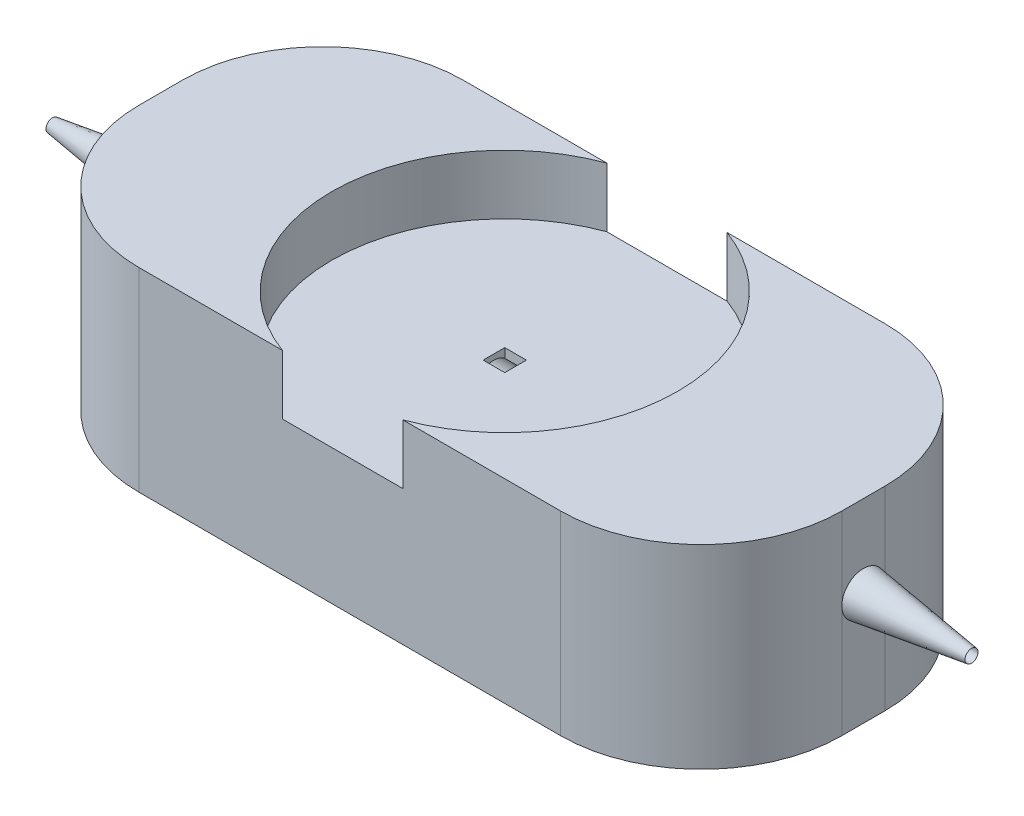
ISO-10303-21;
HEADER;
FILE_DESCRIPTION(('STEP AP214'),'2;1');
FILE_NAME('part.step','',(''),(''),'','','');
FILE_SCHEMA(('AUTOMOTIVE_DESIGN { 1 0 10303 214 1 1 1 1 }'));
ENDSEC;
DATA;
#1=APPLICATION_CONTEXT('core data for automotive mechanical design processes');
#2=APPLICATION_PROTOCOL_DEFINITION('international standard','automotive_design',2000,#1);
#3=PRODUCT_CONTEXT('',#1,'mechanical');
#4=PRODUCT('Part','Part','',(#3));
#5=PRODUCT_RELATED_PRODUCT_CATEGORY('part','',(#4));
#6=PRODUCT_DEFINITION_FORMATION('','',#4);
#7=PRODUCT_DEFINITION_CONTEXT('part definition',#1,'design');
#8=PRODUCT_DEFINITION('design','',#6,#7);
#9=PRODUCT_DEFINITION_SHAPE('','',#8);
#10=(LENGTH_UNIT() NAMED_UNIT(*) SI_UNIT(.MILLI.,.METRE.));
#11=(NAMED_UNIT(*) PLANE_ANGLE_UNIT() SI_UNIT($,.RADIAN.));
#12=(NAMED_UNIT(*) SI_UNIT($,.STERADIAN.) SOLID_ANGLE_UNIT());
#13=UNCERTAINTY_MEASURE_WITH_UNIT(LENGTH_MEASURE(1.E-05),#10,'distance_accuracy_value','');
#14=(GEOMETRIC_REPRESENTATION_CONTEXT(3) GLOBAL_UNCERTAINTY_ASSIGNED_CONTEXT((#13)) GLOBAL_UNIT_ASSIGNED_CONTEXT((#10,
#11,#12)) REPRESENTATION_CONTEXT('',''));
#15=CARTESIAN_POINT('',(0.,0.,0.));
#16=DIRECTION('',(0.,0.,1.));
#17=DIRECTION('',(1.,0.,0.));
#18=AXIS2_PLACEMENT_3D('',#15,#16,#17);
#19=CARTESIAN_POINT('',(40.001,50.4,0.));
#20=DIRECTION('',(-1.,0.,0.));
#21=DIRECTION('',(0.,0.,1.));
#22=AXIS2_PLACEMENT_3D('',#19,#20,#21);
#23=CYLINDRICAL_SURFACE('',#22,1.6);
#24=CARTESIAN_POINT('',(-25.,50.4,0.));
#25=DIRECTION('',(1.,0.,0.));
#26=DIRECTION('',(0.,0.,-1.));
#27=AXIS2_PLACEMENT_3D('',#24,#25,#26);
#28=CIRCLE('',#27,1.6);
#29=CARTESIAN_POINT('',(-25.,50.4,-1.6));
#30=VERTEX_POINT('',#29);
#31=EDGE_CURVE('E725',#30,#30,#28,.F.);
#32=ORIENTED_EDGE('',*,*,#31,.T.);
#33=EDGE_LOOP('',(#32));
#34=FACE_BOUND('',#33,.T.);
#35=DIRECTION('',(-1.,0.,0.));
#36=VECTOR('',#35,1.);
#37=CARTESIAN_POINT('',(40.001,51.6489995996798,0.999999999999832));
#38=LINE('',#37,#36);
#39=CARTESIAN_POINT('',(5.82850828649366,51.6489995996798,0.999999999999832));
#40=VERTEX_POINT('',#39);
#41=CARTESIAN_POINT('',(7.82850828649366,51.6489995996798,0.999999999999832));
#42=VERTEX_POINT('',#41);
#43=EDGE_CURVE('E256',#40,#42,#38,.F.);
#44=ORIENTED_EDGE('',*,*,#43,.T.);
#45=CARTESIAN_POINT('',(7.82850828649365,50.4,0.));
#46=DIRECTION('',(1.,0.,0.));
#47=DIRECTION('',(0.,0.,-1.));
#48=AXIS2_PLACEMENT_3D('',#45,#46,#47);
#49=CIRCLE('',#48,1.6);
#50=CARTESIAN_POINT('',(7.82850828649366,51.6489995996795,-1.00000000000017));
#51=VERTEX_POINT('',#50);
#52=EDGE_CURVE('E261',#42,#51,#49,.F.);
#53=ORIENTED_EDGE('',*,*,#52,.T.);
#54=DIRECTION('',(-1.,0.,0.));
#55=VECTOR('',#54,1.);
#56=CARTESIAN_POINT('',(40.001,51.6489995996795,-1.00000000000017));
#57=LINE('',#56,#55);
#58=CARTESIAN_POINT('',(5.82850828649366,51.6489995996795,-1.00000000000017));
#59=VERTEX_POINT('',#58);
#60=EDGE_CURVE('E248',#51,#59,#57,.T.);
#61=ORIENTED_EDGE('',*,*,#60,.T.);
#62=CARTESIAN_POINT('',(5.82850828649366,50.4,0.));
#63=DIRECTION('',(-1.,0.,0.));
#64=DIRECTION('',(0.,0.,1.));
#65=AXIS2_PLACEMENT_3D('',#62,#63,#64);
#66=CIRCLE('',#65,1.6);
#67=EDGE_CURVE('E252',#59,#40,#66,.F.);
#68=ORIENTED_EDGE('',*,*,#67,.T.);
#69=EDGE_LOOP('',(#44,#53,#61,#68));
#70=FACE_BOUND('',#69,.T.);
#71=DIRECTION('',(-1.,0.,0.));
#72=VECTOR('',#71,1.);
#73=CARTESIAN_POINT('',(40.001,49.1510004003205,-1.00000000000017));
#74=LINE('',#73,#72);
#75=CARTESIAN_POINT('',(5.82850828649366,49.1510004003205,-1.00000000000017));
#76=VERTEX_POINT('',#75);
#77=CARTESIAN_POINT('',(7.82850828649365,49.1510004003205,-1.00000000000017));
#78=VERTEX_POINT('',#77);
#79=EDGE_CURVE('E265',#76,#78,#74,.F.);
#80=ORIENTED_EDGE('',*,*,#79,.T.);
#81=CARTESIAN_POINT('',(7.82850828649366,49.1510004003202,0.999999999999832));
#82=VERTEX_POINT('',#81);
#83=EDGE_CURVE('E266',#78,#82,#49,.F.);
#84=ORIENTED_EDGE('',*,*,#83,.T.);
#85=DIRECTION('',(-1.,0.,0.));
#86=VECTOR('',#85,1.);
#87=CARTESIAN_POINT('',(40.001,49.1510004003202,0.999999999999832));
#88=LINE('',#87,#86);
#89=CARTESIAN_POINT('',(5.82850828649366,49.1510004003202,0.999999999999832));
#90=VERTEX_POINT('',#89);
#91=EDGE_CURVE('E270',#82,#90,#88,.T.);
#92=ORIENTED_EDGE('',*,*,#91,.T.);
#93=EDGE_CURVE('E257',#90,#76,#66,.F.);
#94=ORIENTED_EDGE('',*,*,#93,.T.);
#95=EDGE_LOOP('',(#80,#84,#92,#94));
#96=FACE_BOUND('',#95,.T.);
#97=CARTESIAN_POINT('',(39.9952357151676,50.4,0.));
#98=DIRECTION('',(1.,0.,0.));
#99=DIRECTION('',(0.,0.,-1.));
#100=AXIS2_PLACEMENT_3D('',#97,#98,#99);
#101=CIRCLE('',#100,1.6);
#102=CARTESIAN_POINT('',(39.9952357151676,50.4,-1.6));
#103=VERTEX_POINT('',#102);
#104=EDGE_CURVE('E56',#103,#103,#101,.F.);
#105=ORIENTED_EDGE('',*,*,#104,.F.);
#106=EDGE_LOOP('',(#105));
#107=FACE_BOUND('',#106,.T.);
#108=ADVANCED_FACE('F47',(#34,#70,#96,#107),#23,.F.);
#109=CARTESIAN_POINT('',(-25.,58.,15.));
#110=DIRECTION('',(1.,0.,0.));
#111=DIRECTION('',(0.,0.,-1.));
#112=AXIS2_PLACEMENT_3D('',#109,#110,#111);
#113=PLANE('',#112);
#114=DIRECTION('',(0.,-1.,0.));
#115=VECTOR('',#114,1.);
#116=CARTESIAN_POINT('',(-25.,58.,-1.99999999999999));
#117=LINE('',#116,#115);
#118=CARTESIAN_POINT('',(-25.,58.,-1.99999999999999));
#119=VERTEX_POINT('',#118);
#120=CARTESIAN_POINT('',(-25.,50.4,-1.99999999999999));
#121=VERTEX_POINT('',#120);
#122=EDGE_CURVE('E205',#119,#121,#117,.T.);
#123=ORIENTED_EDGE('',*,*,#122,.T.);
#124=CARTESIAN_POINT('',(-25.,50.4,0.));
#125=DIRECTION('',(1.,0.,0.));
#126=DIRECTION('',(0.,0.,-1.));
#127=AXIS2_PLACEMENT_3D('',#124,#125,#126);
#128=CIRCLE('',#127,2.);
#129=CARTESIAN_POINT('',(-25.,50.4,2.00000000000001));
#130=VERTEX_POINT('',#129);
#131=EDGE_CURVE('E62',#121,#130,#128,.T.);
#132=ORIENTED_EDGE('',*,*,#131,.T.);
#133=DIRECTION('',(0.,-1.,0.));
#134=VECTOR('',#133,1.);
#135=CARTESIAN_POINT('',(-25.,58.,2.00000000000001));
#136=LINE('',#135,#134);
#137=CARTESIAN_POINT('',(-25.,58.,2.00000000000001));
#138=VERTEX_POINT('',#137);
#139=EDGE_CURVE('E202',#130,#138,#136,.F.);
#140=ORIENTED_EDGE('',*,*,#139,.T.);
#141=DIRECTION('',(0.,0.,1.));
#142=VECTOR('',#141,1.);
#143=CARTESIAN_POINT('',(-25.,58.,15.));
#144=LINE('',#143,#142);
#145=EDGE_CURVE('E375',#119,#138,#144,.T.);
#146=ORIENTED_EDGE('',*,*,#145,.F.);
#147=EDGE_LOOP('',(#123,#132,#140,#146));
#148=FACE_BOUND('',#147,.T.);
#149=ADVANCED_FACE('F200',(#148),#113,.F.);
#150=CARTESIAN_POINT('',(0.,58.,0.));
#151=DIRECTION('',(0.,-1.,0.));
#152=DIRECTION('',(0.,0.,-1.));
#153=AXIS2_PLACEMENT_3D('',#150,#151,#152);
#154=PLANE('',#153);
#155=DIRECTION('',(-1.,0.,0.));
#156=VECTOR('',#155,1.);
#157=CARTESIAN_POINT('',(-25.,58.,-15.));
#158=LINE('',#157,#156);
#159=CARTESIAN_POINT('',(27.,58.,-15.));
#160=VERTEX_POINT('',#159);
#161=CARTESIAN_POINT('',(12.3962726493241,58.,-15.));
#162=VERTEX_POINT('',#161);
#163=EDGE_CURVE('E371',#160,#162,#158,.T.);
#164=ORIENTED_EDGE('',*,*,#163,.T.);
#165=CARTESIAN_POINT('',(6.82850828649366,58.,-1.6826817716975E-13));
#166=DIRECTION('',(0.,1.,0.));
#167=DIRECTION('',(0.,0.,1.));
#168=AXIS2_PLACEMENT_3D('',#165,#166,#167);
#169=CIRCLE('',#168,16.);
#170=CARTESIAN_POINT('',(12.3962726493232,58.,15.));
#171=VERTEX_POINT('',#170);
#172=EDGE_CURVE('E296',#171,#162,#169,.T.);
#173=ORIENTED_EDGE('',*,*,#172,.F.);
#174=DIRECTION('',(1.,0.,0.));
#175=VECTOR('',#174,1.);
#176=CARTESIAN_POINT('',(-25.,58.,15.));
#177=LINE('',#176,#175);
#178=CARTESIAN_POINT('',(27.,58.,15.));
#179=VERTEX_POINT('',#178);
#180=EDGE_CURVE('E378',#171,#179,#177,.T.);
#181=ORIENTED_EDGE('',*,*,#180,.T.);
#182=CARTESIAN_POINT('',(27.,58.,2.00000000000001));
#183=DIRECTION('',(0.,-1.,0.));
#184=DIRECTION('',(0.,0.,-1.));
#185=AXIS2_PLACEMENT_3D('',#182,#183,#184);
#186=CIRCLE('',#185,13.);
#187=CARTESIAN_POINT('',(40.,58.,2.00000000000001));
#188=VERTEX_POINT('',#187);
#189=EDGE_CURVE('E400',#179,#188,#186,.F.);
#190=ORIENTED_EDGE('',*,*,#189,.T.);
#191=DIRECTION('',(0.,0.,-1.));
#192=VECTOR('',#191,1.);
#193=CARTESIAN_POINT('',(40.,58.,15.));
#194=LINE('',#193,#192);
#195=CARTESIAN_POINT('',(40.,58.,-2.));
#196=VERTEX_POINT('',#195);
#197=EDGE_CURVE('E366',#188,#196,#194,.T.);
#198=ORIENTED_EDGE('',*,*,#197,.T.);
#199=CARTESIAN_POINT('',(27.,58.,-2.));
#200=DIRECTION('',(0.,-1.,0.));
#201=DIRECTION('',(0.,0.,-1.));
#202=AXIS2_PLACEMENT_3D('',#199,#200,#201);
#203=CIRCLE('',#202,13.);
#204=EDGE_CURVE('E216',#196,#160,#203,.F.);
#205=ORIENTED_EDGE('',*,*,#204,.T.);
#206=EDGE_LOOP('',(#164,#173,#181,#190,#198,#205));
#207=FACE_BOUND('',#206,.T.);
#208=ADVANCED_FACE('F410',(#207),#154,.F.);
#209=CARTESIAN_POINT('',(40.,58.,15.));
#210=DIRECTION('',(-1.,0.,0.));
#211=DIRECTION('',(0.,0.,1.));
#212=AXIS2_PLACEMENT_3D('',#209,#210,#211);
#213=PLANE('',#212);
#214=CARTESIAN_POINT('',(40.,50.4,0.));
#215=DIRECTION('',(-1.,0.,0.));
#216=DIRECTION('',(0.,0.,1.));
#217=AXIS2_PLACEMENT_3D('',#214,#215,#216);
#218=CIRCLE('',#217,1.99933300012347);
#219=CARTESIAN_POINT('',(40.,50.4,1.99933300012347));
#220=VERTEX_POINT('',#219);
#221=EDGE_CURVE('E11',#220,#220,#218,.F.);
#222=ORIENTED_EDGE('',*,*,#221,.F.);
#223=EDGE_LOOP('',(#222));
#224=FACE_BOUND('',#223,.T.);
#225=DIRECTION('',(0.,0.,1.));
#226=VECTOR('',#225,1.);
#227=CARTESIAN_POINT('',(40.,40.,15.));
#228=LINE('',#227,#226);
#229=CARTESIAN_POINT('',(40.,40.,-2.));
#230=VERTEX_POINT('',#229);
#231=CARTESIAN_POINT('',(40.,40.,2.00000000000001));
#232=VERTEX_POINT('',#231);
#233=EDGE_CURVE('E359',#230,#232,#228,.T.);
#234=ORIENTED_EDGE('',*,*,#233,.F.);
#235=DIRECTION('',(0.,-1.,0.));
#236=VECTOR('',#235,1.);
#237=CARTESIAN_POINT('',(40.,58.,-2.));
#238=LINE('',#237,#236);
#239=EDGE_CURVE('E395',#230,#196,#238,.F.);
#240=ORIENTED_EDGE('',*,*,#239,.T.);
#241=ORIENTED_EDGE('',*,*,#197,.F.);
#242=DIRECTION('',(0.,-1.,0.));
#243=VECTOR('',#242,1.);
#244=CARTESIAN_POINT('',(40.,58.,2.00000000000001));
#245=LINE('',#244,#243);
#246=EDGE_CURVE('E391',#188,#232,#245,.T.);
#247=ORIENTED_EDGE('',*,*,#246,.T.);
#248=EDGE_LOOP('',(#234,#240,#241,#247));
#249=FACE_BOUND('',#248,.T.);
#250=ADVANCED_FACE('F425',(#224,#249),#213,.F.);
#251=CARTESIAN_POINT('',(-25.,58.,-15.));
#252=DIRECTION('',(0.,0.,1.));
#253=DIRECTION('',(1.,0.,0.));
#254=AXIS2_PLACEMENT_3D('',#251,#252,#253);
#255=PLANE('',#254);
#256=DIRECTION('',(-1.,0.,0.));
#257=VECTOR('',#256,1.);
#258=CARTESIAN_POINT('',(-25.,52.5,-15.));
#259=LINE('',#258,#257);
#260=CARTESIAN_POINT('',(12.3962726493241,52.5,-15.));
#261=VERTEX_POINT('',#260);
#262=CARTESIAN_POINT('',(1.26074392366317,52.5,-15.));
#263=VERTEX_POINT('',#262);
#264=EDGE_CURVE('E340',#261,#263,#259,.T.);
#265=ORIENTED_EDGE('',*,*,#264,.F.);
#266=DIRECTION('',(0.,1.,0.));
#267=VECTOR('',#266,1.);
#268=CARTESIAN_POINT('',(12.3962726493241,52.5,-15.));
#269=LINE('',#268,#267);
#270=EDGE_CURVE('E336',#261,#162,#269,.T.);
#271=ORIENTED_EDGE('',*,*,#270,.T.);
#272=ORIENTED_EDGE('',*,*,#163,.F.);
#273=DIRECTION('',(0.,-1.,0.));
#274=VECTOR('',#273,1.);
#275=CARTESIAN_POINT('',(27.,58.,-15.));
#276=LINE('',#275,#274);
#277=CARTESIAN_POINT('',(27.,40.,-15.));
#278=VERTEX_POINT('',#277);
#279=EDGE_CURVE('E387',#160,#278,#276,.T.);
#280=ORIENTED_EDGE('',*,*,#279,.T.);
#281=DIRECTION('',(1.,0.,0.));
#282=VECTOR('',#281,1.);
#283=CARTESIAN_POINT('',(-25.,40.,-15.));
#284=LINE('',#283,#282);
#285=CARTESIAN_POINT('',(-12.,40.,-15.));
#286=VERTEX_POINT('',#285);
#287=EDGE_CURVE('E356',#286,#278,#284,.T.);
#288=ORIENTED_EDGE('',*,*,#287,.F.);
#289=DIRECTION('',(0.,-1.,0.));
#290=VECTOR('',#289,1.);
#291=CARTESIAN_POINT('',(-12.,58.,-15.));
#292=LINE('',#291,#290);
#293=CARTESIAN_POINT('',(-12.,58.,-15.));
#294=VERTEX_POINT('',#293);
#295=EDGE_CURVE('E383',#286,#294,#292,.F.);
#296=ORIENTED_EDGE('',*,*,#295,.T.);
#297=CARTESIAN_POINT('',(1.26074392366317,58.,-15.));
#298=VERTEX_POINT('',#297);
#299=EDGE_CURVE('E370',#298,#294,#158,.T.);
#300=ORIENTED_EDGE('',*,*,#299,.F.);
#301=DIRECTION('',(0.,1.,0.));
#302=VECTOR('',#301,1.);
#303=CARTESIAN_POINT('',(1.26074392366316,52.5,-15.));
#304=LINE('',#303,#302);
#305=EDGE_CURVE('E332',#298,#263,#304,.F.);
#306=ORIENTED_EDGE('',*,*,#305,.T.);
#307=EDGE_LOOP('',(#265,#271,#272,#280,#288,#296,#300,#306));
#308=FACE_BOUND('',#307,.T.);
#309=ADVANCED_FACE('F418',(#308),#255,.F.);
#310=CARTESIAN_POINT('',(-25.,40.,2.00000000000001));
#311=VERTEX_POINT('',#310);
#312=EDGE_CURVE('E212',#311,#130,#136,.F.);
#313=ORIENTED_EDGE('',*,*,#312,.T.);
#314=EDGE_CURVE('E189',#130,#121,#128,.T.);
#315=ORIENTED_EDGE('',*,*,#314,.T.);
#316=CARTESIAN_POINT('',(-25.,40.,-1.99999999999999));
#317=VERTEX_POINT('',#316);
#318=EDGE_CURVE('E223',#121,#317,#117,.T.);
#319=ORIENTED_EDGE('',*,*,#318,.T.);
#320=DIRECTION('',(0.,0.,-1.));
#321=VECTOR('',#320,1.);
#322=CARTESIAN_POINT('',(-25.,40.,15.));
#323=LINE('',#322,#321);
#324=EDGE_CURVE('E221',#311,#317,#323,.T.);
#325=ORIENTED_EDGE('',*,*,#324,.F.);
#326=EDGE_LOOP('',(#313,#315,#319,#325));
#327=FACE_BOUND('',#326,.T.);
#328=ADVANCED_FACE('F219',(#327),#113,.F.);
#329=CARTESIAN_POINT('',(-25.,58.,15.));
#330=DIRECTION('',(0.,0.,-1.));
#331=DIRECTION('',(-1.,0.,0.));
#332=AXIS2_PLACEMENT_3D('',#329,#330,#331);
#333=PLANE('',#332);
#334=DIRECTION('',(1.,0.,0.));
#335=VECTOR('',#334,1.);
#336=CARTESIAN_POINT('',(-25.,52.5,15.));
#337=LINE('',#336,#335);
#338=CARTESIAN_POINT('',(1.2607439236641,52.5,15.));
#339=VERTEX_POINT('',#338);
#340=CARTESIAN_POINT('',(12.3962726493232,52.5,15.));
#341=VERTEX_POINT('',#340);
#342=EDGE_CURVE('E245',#339,#341,#337,.T.);
#343=ORIENTED_EDGE('',*,*,#342,.F.);
#344=DIRECTION('',(0.,1.,0.));
#345=VECTOR('',#344,1.);
#346=CARTESIAN_POINT('',(1.26074392366409,52.5,15.));
#347=LINE('',#346,#345);
#348=CARTESIAN_POINT('',(1.2607439236641,58.,15.));
#349=VERTEX_POINT('',#348);
#350=EDGE_CURVE('E328',#339,#349,#347,.T.);
#351=ORIENTED_EDGE('',*,*,#350,.T.);
#352=CARTESIAN_POINT('',(-12.,58.,15.));
#353=VERTEX_POINT('',#352);
#354=EDGE_CURVE('E379',#353,#349,#177,.T.);
#355=ORIENTED_EDGE('',*,*,#354,.F.);
#356=DIRECTION('',(0.,-1.,0.));
#357=VECTOR('',#356,1.);
#358=CARTESIAN_POINT('',(-12.,58.,15.));
#359=LINE('',#358,#357);
#360=CARTESIAN_POINT('',(-12.,40.,15.));
#361=VERTEX_POINT('',#360);
#362=EDGE_CURVE('E230',#353,#361,#359,.T.);
#363=ORIENTED_EDGE('',*,*,#362,.T.);
#364=DIRECTION('',(-1.,0.,0.));
#365=VECTOR('',#364,1.);
#366=CARTESIAN_POINT('',(-25.,40.,15.));
#367=LINE('',#366,#365);
#368=CARTESIAN_POINT('',(27.,40.,15.));
#369=VERTEX_POINT('',#368);
#370=EDGE_CURVE('E343',#369,#361,#367,.T.);
#371=ORIENTED_EDGE('',*,*,#370,.F.);
#372=DIRECTION('',(0.,-1.,0.));
#373=VECTOR('',#372,1.);
#374=CARTESIAN_POINT('',(27.,58.,15.));
#375=LINE('',#374,#373);
#376=EDGE_CURVE('E234',#369,#179,#375,.F.);
#377=ORIENTED_EDGE('',*,*,#376,.T.);
#378=ORIENTED_EDGE('',*,*,#180,.F.);
#379=DIRECTION('',(0.,1.,0.));
#380=VECTOR('',#379,1.);
#381=CARTESIAN_POINT('',(12.3962726493232,52.5,15.));
#382=LINE('',#381,#380);
#383=EDGE_CURVE('E323',#171,#341,#382,.F.);
#384=ORIENTED_EDGE('',*,*,#383,.T.);
#385=EDGE_LOOP('',(#343,#351,#355,#363,#371,#377,#378,#384));
#386=FACE_BOUND('',#385,.T.);
#387=ADVANCED_FACE('F434',(#386),#333,.F.);
#388=CARTESIAN_POINT('',(27.,58.,-2.));
#389=DIRECTION('',(0.,-1.,0.));
#390=DIRECTION('',(0.,0.,-1.));
#391=AXIS2_PLACEMENT_3D('',#388,#389,#390);
#392=CYLINDRICAL_SURFACE('',#391,13.);
#393=ORIENTED_EDGE('',*,*,#239,.F.);
#394=CARTESIAN_POINT('',(27.,40.,-2.));
#395=DIRECTION('',(0.,-1.,0.));
#396=DIRECTION('',(0.,0.,-1.));
#397=AXIS2_PLACEMENT_3D('',#394,#395,#396);
#398=CIRCLE('',#397,13.);
#399=EDGE_CURVE('E362',#230,#278,#398,.F.);
#400=ORIENTED_EDGE('',*,*,#399,.T.);
#401=ORIENTED_EDGE('',*,*,#279,.F.);
#402=ORIENTED_EDGE('',*,*,#204,.F.);
#403=EDGE_LOOP('',(#393,#400,#401,#402));
#404=FACE_BOUND('',#403,.T.);
#405=ADVANCED_FACE('F420',(#404),#392,.T.);
#406=CARTESIAN_POINT('',(-12.,58.,-1.99999999999999));
#407=DIRECTION('',(0.,-1.,0.));
#408=DIRECTION('',(0.,0.,-1.));
#409=AXIS2_PLACEMENT_3D('',#406,#407,#408);
#410=CYLINDRICAL_SURFACE('',#409,13.);
#411=ORIENTED_EDGE('',*,*,#295,.F.);
#412=CARTESIAN_POINT('',(-12.,40.,-1.99999999999999));
#413=DIRECTION('',(0.,-1.,0.));
#414=DIRECTION('',(0.,0.,-1.));
#415=AXIS2_PLACEMENT_3D('',#412,#413,#414);
#416=CIRCLE('',#415,13.);
#417=EDGE_CURVE('E352',#286,#317,#416,.F.);
#418=ORIENTED_EDGE('',*,*,#417,.T.);
#419=ORIENTED_EDGE('',*,*,#318,.F.);
#420=ORIENTED_EDGE('',*,*,#122,.F.);
#421=CARTESIAN_POINT('',(-12.,58.,-1.99999999999999));
#422=DIRECTION('',(0.,-1.,0.));
#423=DIRECTION('',(0.,0.,-1.));
#424=AXIS2_PLACEMENT_3D('',#421,#422,#423);
#425=CIRCLE('',#424,13.);
#426=EDGE_CURVE('E402',#294,#119,#425,.F.);
#427=ORIENTED_EDGE('',*,*,#426,.F.);
#428=EDGE_LOOP('',(#411,#418,#419,#420,#427));
#429=FACE_BOUND('',#428,.T.);
#430=ADVANCED_FACE('F439',(#429),#410,.T.);
#431=CARTESIAN_POINT('',(27.,58.,2.00000000000001));
#432=DIRECTION('',(0.,-1.,0.));
#433=DIRECTION('',(0.,0.,-1.));
#434=AXIS2_PLACEMENT_3D('',#431,#432,#433);
#435=CYLINDRICAL_SURFACE('',#434,13.);
#436=ORIENTED_EDGE('',*,*,#376,.F.);
#437=CARTESIAN_POINT('',(27.,40.,2.00000000000001));
#438=DIRECTION('',(0.,-1.,0.));
#439=DIRECTION('',(0.,0.,-1.));
#440=AXIS2_PLACEMENT_3D('',#437,#438,#439);
#441=CIRCLE('',#440,13.);
#442=EDGE_CURVE('E348',#369,#232,#441,.F.);
#443=ORIENTED_EDGE('',*,*,#442,.T.);
#444=ORIENTED_EDGE('',*,*,#246,.F.);
#445=ORIENTED_EDGE('',*,*,#189,.F.);
#446=EDGE_LOOP('',(#436,#443,#444,#445));
#447=FACE_BOUND('',#446,.T.);
#448=ADVANCED_FACE('F430',(#447),#435,.T.);
#449=CARTESIAN_POINT('',(-12.,58.,2.00000000000001));
#450=DIRECTION('',(0.,-1.,0.));
#451=DIRECTION('',(0.,0.,-1.));
#452=AXIS2_PLACEMENT_3D('',#449,#450,#451);
#453=CYLINDRICAL_SURFACE('',#452,13.);
#454=ORIENTED_EDGE('',*,*,#312,.F.);
#455=CARTESIAN_POINT('',(-12.,40.,2.00000000000001));
#456=DIRECTION('',(0.,-1.,0.));
#457=DIRECTION('',(0.,0.,-1.));
#458=AXIS2_PLACEMENT_3D('',#455,#456,#457);
#459=CIRCLE('',#458,13.);
#460=EDGE_CURVE('E238',#311,#361,#459,.F.);
#461=ORIENTED_EDGE('',*,*,#460,.T.);
#462=ORIENTED_EDGE('',*,*,#362,.F.);
#463=CARTESIAN_POINT('',(-12.,58.,2.00000000000001));
#464=DIRECTION('',(0.,-1.,0.));
#465=DIRECTION('',(0.,0.,-1.));
#466=AXIS2_PLACEMENT_3D('',#463,#464,#465);
#467=CIRCLE('',#466,13.);
#468=EDGE_CURVE('E214',#138,#353,#467,.F.);
#469=ORIENTED_EDGE('',*,*,#468,.F.);
#470=ORIENTED_EDGE('',*,*,#139,.F.);
#471=EDGE_LOOP('',(#454,#461,#462,#469,#470));
#472=FACE_BOUND('',#471,.T.);
#473=ADVANCED_FACE('F49',(#472),#453,.T.);
#474=ORIENTED_EDGE('',*,*,#354,.T.);
#475=CARTESIAN_POINT('',(6.82850828649366,58.,-1.6826817716975E-13));
#476=DIRECTION('',(0.,-1.,0.));
#477=DIRECTION('',(0.,0.,-1.));
#478=AXIS2_PLACEMENT_3D('',#475,#476,#477);
#479=CIRCLE('',#478,16.);
#480=EDGE_CURVE('E241',#349,#298,#479,.T.);
#481=ORIENTED_EDGE('',*,*,#480,.T.);
#482=ORIENTED_EDGE('',*,*,#299,.T.);
#483=ORIENTED_EDGE('',*,*,#426,.T.);
#484=ORIENTED_EDGE('',*,*,#145,.T.);
#485=ORIENTED_EDGE('',*,*,#468,.T.);
#486=EDGE_LOOP('',(#474,#481,#482,#483,#484,#485));
#487=FACE_BOUND('',#486,.T.);
#488=ADVANCED_FACE('F533',(#487),#154,.F.);
#489=CARTESIAN_POINT('',(0.,40.,0.));
#490=DIRECTION('',(0.,-1.,0.));
#491=DIRECTION('',(0.,0.,-1.));
#492=AXIS2_PLACEMENT_3D('',#489,#490,#491);
#493=PLANE('',#492);
#494=ORIENTED_EDGE('',*,*,#233,.T.);
#495=ORIENTED_EDGE('',*,*,#442,.F.);
#496=ORIENTED_EDGE('',*,*,#370,.T.);
#497=ORIENTED_EDGE('',*,*,#460,.F.);
#498=ORIENTED_EDGE('',*,*,#324,.T.);
#499=ORIENTED_EDGE('',*,*,#417,.F.);
#500=ORIENTED_EDGE('',*,*,#287,.T.);
#501=ORIENTED_EDGE('',*,*,#399,.F.);
#502=EDGE_LOOP('',(#494,#495,#496,#497,#498,#499,#500,#501));
#503=FACE_BOUND('',#502,.T.);
#504=ADVANCED_FACE('F423',(#503),#493,.T.);
#505=CARTESIAN_POINT('',(6.82850828649366,52.5,-1.6826817716975E-13));
#506=DIRECTION('',(0.,1.,0.));
#507=DIRECTION('',(0.,0.,1.));
#508=AXIS2_PLACEMENT_3D('',#505,#506,#507);
#509=PLANE('',#508);
#510=DIRECTION('',(0.,0.,-1.));
#511=VECTOR('',#510,1.);
#512=CARTESIAN_POINT('',(7.82850828649366,52.5,0.999999999999832));
#513=LINE('',#512,#511);
#514=CARTESIAN_POINT('',(7.82850828649366,52.5,0.999999999999832));
#515=VERTEX_POINT('',#514);
#516=CARTESIAN_POINT('',(7.82850828649366,52.5,-1.00000000000017));
#517=VERTEX_POINT('',#516);
#518=EDGE_CURVE('E70',#515,#517,#513,.T.);
#519=ORIENTED_EDGE('',*,*,#518,.F.);
#520=DIRECTION('',(1.,0.,0.));
#521=VECTOR('',#520,1.);
#522=CARTESIAN_POINT('',(5.82850828649366,52.5,0.999999999999832));
#523=LINE('',#522,#521);
#524=CARTESIAN_POINT('',(5.82850828649366,52.5,0.999999999999832));
#525=VERTEX_POINT('',#524);
#526=EDGE_CURVE('E306',#525,#515,#523,.T.);
#527=ORIENTED_EDGE('',*,*,#526,.F.);
#528=DIRECTION('',(0.,0.,1.));
#529=VECTOR('',#528,1.);
#530=CARTESIAN_POINT('',(5.82850828649366,52.5,0.999999999999832));
#531=LINE('',#530,#529);
#532=CARTESIAN_POINT('',(5.82850828649366,52.5,-1.00000000000017));
#533=VERTEX_POINT('',#532);
#534=EDGE_CURVE('E720',#533,#525,#531,.T.);
#535=ORIENTED_EDGE('',*,*,#534,.F.);
#536=DIRECTION('',(-1.,0.,0.));
#537=VECTOR('',#536,1.);
#538=CARTESIAN_POINT('',(5.82850828649366,52.5,-1.00000000000017));
#539=LINE('',#538,#537);
#540=EDGE_CURVE('E723',#517,#533,#539,.T.);
#541=ORIENTED_EDGE('',*,*,#540,.F.);
#542=EDGE_LOOP('',(#519,#527,#535,#541));
#543=FACE_BOUND('',#542,.T.);
#544=ORIENTED_EDGE('',*,*,#264,.T.);
#545=CARTESIAN_POINT('',(6.82850828649366,52.5,-1.6826817716975E-13));
#546=DIRECTION('',(0.,1.,0.));
#547=DIRECTION('',(0.,0.,1.));
#548=AXIS2_PLACEMENT_3D('',#545,#546,#547);
#549=CIRCLE('',#548,16.);
#550=EDGE_CURVE('E301',#263,#339,#549,.T.);
#551=ORIENTED_EDGE('',*,*,#550,.T.);
#552=ORIENTED_EDGE('',*,*,#342,.T.);
#553=EDGE_CURVE('E320',#341,#261,#549,.T.);
#554=ORIENTED_EDGE('',*,*,#553,.T.);
#555=EDGE_LOOP('',(#544,#551,#552,#554));
#556=FACE_BOUND('',#555,.T.);
#557=ADVANCED_FACE('F446',(#543,#556),#509,.T.);
#558=CARTESIAN_POINT('',(6.82850828649366,52.5,-1.6826817716975E-13));
#559=DIRECTION('',(0.,1.,0.));
#560=DIRECTION('',(0.,0.,1.));
#561=AXIS2_PLACEMENT_3D('',#558,#559,#560);
#562=CYLINDRICAL_SURFACE('',#561,16.);
#563=ORIENTED_EDGE('',*,*,#553,.F.);
#564=ORIENTED_EDGE('',*,*,#383,.F.);
#565=ORIENTED_EDGE('',*,*,#172,.T.);
#566=ORIENTED_EDGE('',*,*,#270,.F.);
#567=EDGE_LOOP('',(#563,#564,#565,#566));
#568=FACE_BOUND('',#567,.T.);
#569=ADVANCED_FACE('F450',(#568),#562,.F.);
#570=ORIENTED_EDGE('',*,*,#480,.F.);
#571=ORIENTED_EDGE('',*,*,#350,.F.);
#572=ORIENTED_EDGE('',*,*,#550,.F.);
#573=ORIENTED_EDGE('',*,*,#305,.F.);
#574=EDGE_LOOP('',(#570,#571,#572,#573));
#575=FACE_BOUND('',#574,.T.);
#576=ADVANCED_FACE('F453',(#575),#562,.F.);
#577=CARTESIAN_POINT('',(5.82850828649366,44.5,-1.00000000000017));
#578=DIRECTION('',(0.,0.,-1.));
#579=DIRECTION('',(-1.,0.,0.));
#580=AXIS2_PLACEMENT_3D('',#577,#578,#579);
#581=PLANE('',#580);
#582=DIRECTION('',(0.,1.,0.));
#583=VECTOR('',#582,1.);
#584=CARTESIAN_POINT('',(7.82850828649366,44.5,-1.00000000000017));
#585=LINE('',#584,#583);
#586=EDGE_CURVE('E319',#51,#517,#585,.T.);
#587=ORIENTED_EDGE('',*,*,#586,.T.);
#588=ORIENTED_EDGE('',*,*,#540,.T.);
#589=DIRECTION('',(0.,1.,0.));
#590=VECTOR('',#589,1.);
#591=CARTESIAN_POINT('',(5.82850828649366,44.5,-1.00000000000017));
#592=LINE('',#591,#590);
#593=EDGE_CURVE('E316',#59,#533,#592,.T.);
#594=ORIENTED_EDGE('',*,*,#593,.F.);
#595=ORIENTED_EDGE('',*,*,#60,.F.);
#596=EDGE_LOOP('',(#587,#588,#594,#595));
#597=FACE_BOUND('',#596,.T.);
#598=ADVANCED_FACE('F459',(#597),#581,.F.);
#599=CARTESIAN_POINT('',(5.82850828649366,44.5,0.999999999999832));
#600=DIRECTION('',(-1.,0.,0.));
#601=DIRECTION('',(0.,0.,1.));
#602=AXIS2_PLACEMENT_3D('',#599,#600,#601);
#603=PLANE('',#602);
#604=ORIENTED_EDGE('',*,*,#593,.T.);
#605=ORIENTED_EDGE('',*,*,#534,.T.);
#606=DIRECTION('',(0.,1.,0.));
#607=VECTOR('',#606,1.);
#608=CARTESIAN_POINT('',(5.82850828649366,44.5,0.999999999999832));
#609=LINE('',#608,#607);
#610=EDGE_CURVE('E311',#40,#525,#609,.T.);
#611=ORIENTED_EDGE('',*,*,#610,.F.);
#612=ORIENTED_EDGE('',*,*,#67,.F.);
#613=EDGE_LOOP('',(#604,#605,#611,#612));
#614=FACE_BOUND('',#613,.T.);
#615=ADVANCED_FACE('F489',(#614),#603,.F.);
#616=CARTESIAN_POINT('',(5.82850828649366,44.5,0.999999999999832));
#617=DIRECTION('',(0.,0.,1.));
#618=DIRECTION('',(1.,0.,0.));
#619=AXIS2_PLACEMENT_3D('',#616,#617,#618);
#620=PLANE('',#619);
#621=ORIENTED_EDGE('',*,*,#610,.T.);
#622=ORIENTED_EDGE('',*,*,#526,.T.);
#623=DIRECTION('',(0.,1.,0.));
#624=VECTOR('',#623,1.);
#625=CARTESIAN_POINT('',(7.82850828649366,44.5,0.999999999999832));
#626=LINE('',#625,#624);
#627=EDGE_CURVE('E297',#42,#515,#626,.T.);
#628=ORIENTED_EDGE('',*,*,#627,.F.);
#629=ORIENTED_EDGE('',*,*,#43,.F.);
#630=EDGE_LOOP('',(#621,#622,#628,#629));
#631=FACE_BOUND('',#630,.T.);
#632=ADVANCED_FACE('F490',(#631),#620,.F.);
#633=CARTESIAN_POINT('',(7.82850828649366,44.5,0.999999999999832));
#634=DIRECTION('',(1.,0.,0.));
#635=DIRECTION('',(0.,0.,-1.));
#636=AXIS2_PLACEMENT_3D('',#633,#634,#635);
#637=PLANE('',#636);
#638=ORIENTED_EDGE('',*,*,#627,.T.);
#639=ORIENTED_EDGE('',*,*,#518,.T.);
#640=ORIENTED_EDGE('',*,*,#586,.F.);
#641=ORIENTED_EDGE('',*,*,#52,.F.);
#642=EDGE_LOOP('',(#638,#639,#640,#641));
#643=FACE_BOUND('',#642,.T.);
#644=ADVANCED_FACE('F479',(#643),#637,.F.);
#645=CARTESIAN_POINT('',(7.82850828649366,44.5,-1.00000000000017));
#646=VERTEX_POINT('',#645);
#647=EDGE_CURVE('E287',#646,#78,#585,.T.);
#648=ORIENTED_EDGE('',*,*,#647,.F.);
#649=DIRECTION('',(0.,0.,-1.));
#650=VECTOR('',#649,1.);
#651=CARTESIAN_POINT('',(7.82850828649366,44.5,0.999999999999832));
#652=LINE('',#651,#650);
#653=CARTESIAN_POINT('',(7.82850828649366,44.5,0.999999999999832));
#654=VERTEX_POINT('',#653);
#655=EDGE_CURVE('E291',#654,#646,#652,.T.);
#656=ORIENTED_EDGE('',*,*,#655,.F.);
#657=EDGE_CURVE('E289',#654,#82,#626,.T.);
#658=ORIENTED_EDGE('',*,*,#657,.T.);
#659=ORIENTED_EDGE('',*,*,#83,.F.);
#660=EDGE_LOOP('',(#648,#656,#658,#659));
#661=FACE_BOUND('',#660,.T.);
#662=ADVANCED_FACE('F285',(#661),#637,.F.);
#663=ORIENTED_EDGE('',*,*,#657,.F.);
#664=DIRECTION('',(1.,0.,0.));
#665=VECTOR('',#664,1.);
#666=CARTESIAN_POINT('',(5.82850828649366,44.5,0.999999999999832));
#667=LINE('',#666,#665);
#668=CARTESIAN_POINT('',(5.82850828649366,44.5,0.999999999999832));
#669=VERTEX_POINT('',#668);
#670=EDGE_CURVE('E732',#669,#654,#667,.T.);
#671=ORIENTED_EDGE('',*,*,#670,.F.);
#672=EDGE_CURVE('E303',#669,#90,#609,.T.);
#673=ORIENTED_EDGE('',*,*,#672,.T.);
#674=ORIENTED_EDGE('',*,*,#91,.F.);
#675=EDGE_LOOP('',(#663,#671,#673,#674));
#676=FACE_BOUND('',#675,.T.);
#677=ADVANCED_FACE('F478',(#676),#620,.F.);
#678=ORIENTED_EDGE('',*,*,#672,.F.);
#679=DIRECTION('',(0.,0.,1.));
#680=VECTOR('',#679,1.);
#681=CARTESIAN_POINT('',(5.82850828649366,44.5,0.999999999999832));
#682=LINE('',#681,#680);
#683=CARTESIAN_POINT('',(5.82850828649366,44.5,-1.00000000000017));
#684=VERTEX_POINT('',#683);
#685=EDGE_CURVE('E739',#684,#669,#682,.T.);
#686=ORIENTED_EDGE('',*,*,#685,.F.);
#687=EDGE_CURVE('E312',#684,#76,#592,.T.);
#688=ORIENTED_EDGE('',*,*,#687,.T.);
#689=ORIENTED_EDGE('',*,*,#93,.F.);
#690=EDGE_LOOP('',(#678,#686,#688,#689));
#691=FACE_BOUND('',#690,.T.);
#692=ADVANCED_FACE('F484',(#691),#603,.F.);
#693=ORIENTED_EDGE('',*,*,#687,.F.);
#694=DIRECTION('',(-1.,0.,0.));
#695=VECTOR('',#694,1.);
#696=CARTESIAN_POINT('',(5.82850828649366,44.5,-1.00000000000017));
#697=LINE('',#696,#695);
#698=EDGE_CURVE('E742',#646,#684,#697,.T.);
#699=ORIENTED_EDGE('',*,*,#698,.F.);
#700=ORIENTED_EDGE('',*,*,#647,.T.);
#701=ORIENTED_EDGE('',*,*,#79,.F.);
#702=EDGE_LOOP('',(#693,#699,#700,#701));
#703=FACE_BOUND('',#702,.T.);
#704=ADVANCED_FACE('F480',(#703),#581,.F.);
#705=CARTESIAN_POINT('',(0.,44.5,0.));
#706=DIRECTION('',(0.,-1.,0.));
#707=DIRECTION('',(0.,0.,-1.));
#708=AXIS2_PLACEMENT_3D('',#705,#706,#707);
#709=PLANE('',#708);
#710=ORIENTED_EDGE('',*,*,#655,.T.);
#711=ORIENTED_EDGE('',*,*,#698,.T.);
#712=ORIENTED_EDGE('',*,*,#685,.T.);
#713=ORIENTED_EDGE('',*,*,#670,.T.);
#714=EDGE_LOOP('',(#710,#711,#712,#713));
#715=FACE_BOUND('',#714,.T.);
#716=ADVANCED_FACE('F483',(#715),#709,.F.);
#717=CARTESIAN_POINT('',(-25.,51.,0.));
#718=DIRECTION('',(1.,0.,0.));
#719=DIRECTION('',(0.,0.,-1.));
#720=AXIS2_PLACEMENT_3D('',#717,#718,#719);
#721=PLANE('',#720);
#722=CARTESIAN_POINT('',(-25.,50.4,0.));
#723=DIRECTION('',(1.,0.,0.));
#724=DIRECTION('',(0.,0.,-1.));
#725=AXIS2_PLACEMENT_3D('',#722,#723,#724);
#726=CIRCLE('',#725,0.600000000000003);
#727=CARTESIAN_POINT('',(-25.,50.4,-0.600000000000003));
#728=VERTEX_POINT('',#727);
#729=EDGE_CURVE('E207',#728,#728,#726,.T.);
#730=ORIENTED_EDGE('',*,*,#729,.F.);
#731=EDGE_LOOP('',(#730));
#732=FACE_BOUND('',#731,.T.);
#733=ORIENTED_EDGE('',*,*,#31,.F.);
#734=EDGE_LOOP('',(#733));
#735=FACE_BOUND('',#734,.T.);
#736=ADVANCED_FACE('F496',(#732,#735),#721,.T.);
#737=CARTESIAN_POINT('',(-25.,50.4,0.));
#738=DIRECTION('',(1.,0.,0.));
#739=DIRECTION('',(0.,0.,-1.));
#740=AXIS2_PLACEMENT_3D('',#737,#738,#739);
#741=CYLINDRICAL_SURFACE('',#740,0.600000000000003);
#742=ORIENTED_EDGE('',*,*,#729,.T.);
#743=EDGE_LOOP('',(#742));
#744=FACE_BOUND('',#743,.T.);
#745=CARTESIAN_POINT('',(-35.,50.4,0.));
#746=DIRECTION('',(1.,0.,0.));
#747=DIRECTION('',(0.,0.,-1.));
#748=AXIS2_PLACEMENT_3D('',#745,#746,#747);
#749=CIRCLE('',#748,0.600000000000003);
#750=CARTESIAN_POINT('',(-35.,50.4,-0.600000000000003));
#751=VERTEX_POINT('',#750);
#752=EDGE_CURVE('E195',#751,#751,#749,.T.);
#753=ORIENTED_EDGE('',*,*,#752,.F.);
#754=EDGE_LOOP('',(#753));
#755=FACE_BOUND('',#754,.T.);
#756=ADVANCED_FACE('F498',(#744,#755),#741,.F.);
#757=CARTESIAN_POINT('',(-25.,50.4,0.));
#758=DIRECTION('',(1.,0.,0.));
#759=DIRECTION('',(0.,0.,-1.));
#760=AXIS2_PLACEMENT_3D('',#757,#758,#759);
#761=CONICAL_SURFACE('',#760,2.,0.139095941482071);
#762=ORIENTED_EDGE('',*,*,#752,.T.);
#763=EDGE_LOOP('',(#762));
#764=FACE_BOUND('',#763,.T.);
#765=ORIENTED_EDGE('',*,*,#131,.F.);
#766=ORIENTED_EDGE('',*,*,#314,.F.);
#767=EDGE_LOOP('',(#765,#766));
#768=FACE_BOUND('',#767,.T.);
#769=ADVANCED_FACE('F190',(#764,#768),#761,.T.);
#770=CARTESIAN_POINT('',(49.9952357151676,50.4,0.));
#771=DIRECTION('',(-1.,0.,0.));
#772=DIRECTION('',(0.,0.,1.));
#773=AXIS2_PLACEMENT_3D('',#770,#771,#772);
#774=CONICAL_SURFACE('',#773,0.600000000000003,0.139095941482071);
#775=CARTESIAN_POINT('',(49.9952357151676,50.4,0.));
#776=DIRECTION('',(-1.,0.,0.));
#777=DIRECTION('',(0.,0.,1.));
#778=AXIS2_PLACEMENT_3D('',#775,#776,#777);
#779=CIRCLE('',#778,0.600000000000003);
#780=CARTESIAN_POINT('',(49.9952357151676,50.4,0.600000000000003));
#781=VERTEX_POINT('',#780);
#782=EDGE_CURVE('E523',#781,#781,#779,.T.);
#783=CARTESIAN_POINT('',(49.9952357151676,50.4,0.600000000000003));
#784=CARTESIAN_POINT('',(49.8911186764679,50.4,0.614576385417956));
#785=CARTESIAN_POINT('',(49.7870016377683,50.4,0.629152770835908));
#786=CARTESIAN_POINT('',(49.578767560369,50.4,0.658305541671814));
#787=CARTESIAN_POINT('',(49.4746505216693,50.4,0.672881927089767));
#788=CARTESIAN_POINT('',(49.26641644427,50.4,0.702034697925672));
#789=CARTESIAN_POINT('',(49.1622994055703,50.4,0.716611083343625));
#790=CARTESIAN_POINT('',(48.954065328171,50.4,0.745763854179531));
#791=CARTESIAN_POINT('',(48.8499482894713,50.4,0.760340239597483));
#792=CARTESIAN_POINT('',(48.641714212072,50.4,0.789493010433389));
#793=CARTESIAN_POINT('',(48.5375971733723,50.4,0.804069395851342));
#794=CARTESIAN_POINT('',(48.329363095973,50.4,0.833222166687247));
#795=CARTESIAN_POINT('',(48.2252460572734,50.4,0.8477985521052));
#796=CARTESIAN_POINT('',(48.017011979874,50.4,0.876951322941105));
#797=CARTESIAN_POINT('',(47.9128949411744,50.4,0.891527708359058));
#798=CARTESIAN_POINT('',(47.704660863775,50.4,0.920680479194964));
#799=CARTESIAN_POINT('',(47.6005438250754,50.4,0.935256864612916));
#800=CARTESIAN_POINT('',(47.392309747676,50.4,0.964409635448822));
#801=CARTESIAN_POINT('',(47.2881927089764,50.4,0.978986020866775));
#802=CARTESIAN_POINT('',(47.0799586315771,50.4,1.00813879170268));
#803=CARTESIAN_POINT('',(46.9758415928774,50.4,1.02271517712063));
#804=CARTESIAN_POINT('',(46.7676075154781,50.4,1.05186794795654));
#805=CARTESIAN_POINT('',(46.6634904767784,50.4,1.06644433337449));
#806=CARTESIAN_POINT('',(46.4552563993791,50.4,1.0955971042104));
#807=CARTESIAN_POINT('',(46.3511393606794,50.4,1.11017348962835));
#808=CARTESIAN_POINT('',(46.1429052832801,50.4,1.13932626046426));
#809=CARTESIAN_POINT('',(46.0387882445804,50.4,1.15390264588221));
#810=CARTESIAN_POINT('',(45.8305541671811,50.4,1.18305541671811));
#811=CARTESIAN_POINT('',(45.7264371284814,50.4,1.19763180213607));
#812=CARTESIAN_POINT('',(45.5182030510821,50.4,1.22678457297197));
#813=CARTESIAN_POINT('',(45.4140860123825,50.4,1.24136095838992));
#814=CARTESIAN_POINT('',(45.2058519349831,50.4,1.27051372922583));
#815=CARTESIAN_POINT('',(45.1017348962835,50.4,1.28509011464378));
#816=CARTESIAN_POINT('',(44.8935008188841,50.4,1.31424288547969));
#817=CARTESIAN_POINT('',(44.7893837801845,50.4,1.32881927089764));
#818=CARTESIAN_POINT('',(44.5811497027852,50.4,1.35797204173355));
#819=CARTESIAN_POINT('',(44.4770326640855,50.4,1.3725484271515));
#820=CARTESIAN_POINT('',(44.2687985866862,50.4,1.40170119798741));
#821=CARTESIAN_POINT('',(44.1646815479865,50.4,1.41627758340536));
#822=CARTESIAN_POINT('',(43.9564474705872,50.4,1.44543035424126));
#823=CARTESIAN_POINT('',(43.8523304318875,50.4,1.46000673965922));
#824=CARTESIAN_POINT('',(43.6440963544882,50.4,1.48915951049512));
#825=CARTESIAN_POINT('',(43.5399793157885,50.4,1.50373589591307));
#826=CARTESIAN_POINT('',(43.3317452383892,50.4,1.53288866674898));
#827=CARTESIAN_POINT('',(43.2276281996895,50.4,1.54746505216693));
#828=CARTESIAN_POINT('',(43.0193941222902,50.4,1.57661782300284));
#829=CARTESIAN_POINT('',(42.9152770835906,50.4,1.59119420842079));
#830=CARTESIAN_POINT('',(42.7070430061912,50.4,1.6203469792567));
#831=CARTESIAN_POINT('',(42.6029259674916,50.4,1.63492336467465));
#832=CARTESIAN_POINT('',(42.3946918900922,50.4,1.66407613551056));
#833=CARTESIAN_POINT('',(42.2905748513926,50.4,1.67865252092851));
#834=CARTESIAN_POINT('',(42.0823407739933,50.4,1.70780529176441));
#835=CARTESIAN_POINT('',(41.9782237352936,50.4,1.72238167718237));
#836=CARTESIAN_POINT('',(41.7699896578943,50.4,1.75153444801827));
#837=CARTESIAN_POINT('',(41.6658726191946,50.4,1.76611083343622));
#838=CARTESIAN_POINT('',(41.4576385417953,50.4,1.79526360427213));
#839=CARTESIAN_POINT('',(41.3535215030956,50.4,1.80983998969008));
#840=CARTESIAN_POINT('',(41.1452874256963,50.4,1.83899276052599));
#841=CARTESIAN_POINT('',(41.0411703869966,50.4,1.85356914594394));
#842=CARTESIAN_POINT('',(40.8329363095973,50.4,1.88272191677985));
#843=CARTESIAN_POINT('',(40.7288192708976,50.4,1.8972983021978));
#844=CARTESIAN_POINT('',(40.5205851934983,50.4,1.9264510730337));
#845=CARTESIAN_POINT('',(40.4164681547987,50.4,1.94102745845166));
#846=CARTESIAN_POINT('',(40.2082340773993,50.4,1.97018022928756));
#847=CARTESIAN_POINT('',(40.1041170386997,50.4,1.98475661470552));
#848=CARTESIAN_POINT('',(40.,50.4,1.99933300012347));
#849=B_SPLINE_CURVE_WITH_KNOTS('',3,(#783,#784,#785,#786,#787,#788,#789,#790,#791,#792,#793,
#794,#795,#796,#797,#798,#799,#800,#801,#802,#803,#804,#805,#806,#807,#808,#809,#810,#811,#812,
#813,#814,#815,#816,#817,#818,#819,#820,#821,#822,#823,#824,#825,#826,#827,#828,#829,#830,#831,
#832,#833,#834,#835,#836,#837,#838,#839,#840,#841,#842,#843,#844,#845,#846,#847,#848),
.UNSPECIFIED.,.F.,.F.,(4,2,2,2,2,2,2,2,2,2,2,2,2,2,2,2,2,2,2,2,2,2,2,2,2,2,2,2,2,2,2,2,4),(0.,
0.315397303151053,0.630794606302106,0.946191909453159,1.26158921260421,1.57698651575526,
1.89238381890632,2.20778112205738,2.52317842520843,2.83857572835948,3.15397303151054,
3.46937033466159,3.78476763781264,4.1001649409637,4.41556224411476,4.73095954726581,
5.04635685041686,5.36175415356792,5.67715145671897,5.99254875987002,6.30794606302108,
6.62334336617213,6.93874066932319,7.25413797247424,7.56953527562529,7.88493257877635,
8.2003298819274,8.51572718507846,8.83112448822951,9.14652179138057,9.46191909453162,
9.77731639768267,10.0927137008337),.UNSPECIFIED.);
#850=EDGE_CURVE('BSEAM506',#781,#220,#849,.T.);
#851=ORIENTED_EDGE('',*,*,#782,.T.);
#852=ORIENTED_EDGE('',*,*,#221,.T.);
#853=ORIENTED_EDGE('',*,*,#850,.T.);
#854=ORIENTED_EDGE('',*,*,#850,.F.);
#855=EDGE_LOOP('',(#851,#853,#852,#854));
#856=FACE_BOUND('',#855,.T.);
#857=ADVANCED_FACE('F506',(#856),#774,.T.);
#858=CARTESIAN_POINT('',(39.9952357151676,51.,0.));
#859=DIRECTION('',(1.,0.,0.));
#860=DIRECTION('',(0.,0.,-1.));
#861=AXIS2_PLACEMENT_3D('',#858,#859,#860);
#862=PLANE('',#861);
#863=CARTESIAN_POINT('',(39.9952357151676,50.4,0.));
#864=DIRECTION('',(-1.,0.,0.));
#865=DIRECTION('',(0.,0.,1.));
#866=AXIS2_PLACEMENT_3D('',#863,#864,#865);
#867=CIRCLE('',#866,0.600000000000003);
#868=CARTESIAN_POINT('',(39.9952357151676,50.4,0.600000000000003));
#869=VERTEX_POINT('',#868);
#870=EDGE_CURVE('E756',#869,#869,#867,.T.);
#871=ORIENTED_EDGE('',*,*,#870,.F.);
#872=EDGE_LOOP('',(#871));
#873=FACE_BOUND('',#872,.T.);
#874=ORIENTED_EDGE('',*,*,#104,.T.);
#875=EDGE_LOOP('',(#874));
#876=FACE_BOUND('',#875,.T.);
#877=ADVANCED_FACE('F508',(#873,#876),#862,.F.);
#878=CARTESIAN_POINT('',(-25.,50.4,0.));
#879=DIRECTION('',(-1.,0.,0.));
#880=DIRECTION('',(0.,0.,1.));
#881=AXIS2_PLACEMENT_3D('',#878,#879,#880);
#882=CYLINDRICAL_SURFACE('',#881,0.600000000000003);
#883=ORIENTED_EDGE('',*,*,#782,.F.);
#884=EDGE_LOOP('',(#883));
#885=FACE_BOUND('',#884,.T.);
#886=ORIENTED_EDGE('',*,*,#870,.T.);
#887=EDGE_LOOP('',(#886));
#888=FACE_BOUND('',#887,.T.);
#889=ADVANCED_FACE('F511',(#885,#888),#882,.F.);
#890=CLOSED_SHELL('',(#108,#149,#208,#250,#309,#328,#387,#405,#430,#448,#473,#488,#504,#557,
#569,#576,#598,#615,#632,#644,#662,#677,#692,#704,#716,#736,#756,#769,#857,#877,#889));
#891=MANIFOLD_SOLID_BREP('B2',#890);
#892=ADVANCED_BREP_SHAPE_REPRESENTATION('',(#18,#891),#14);
#893=SHAPE_DEFINITION_REPRESENTATION(#9,#892);
ENDSEC;
END-ISO-10303-21;
